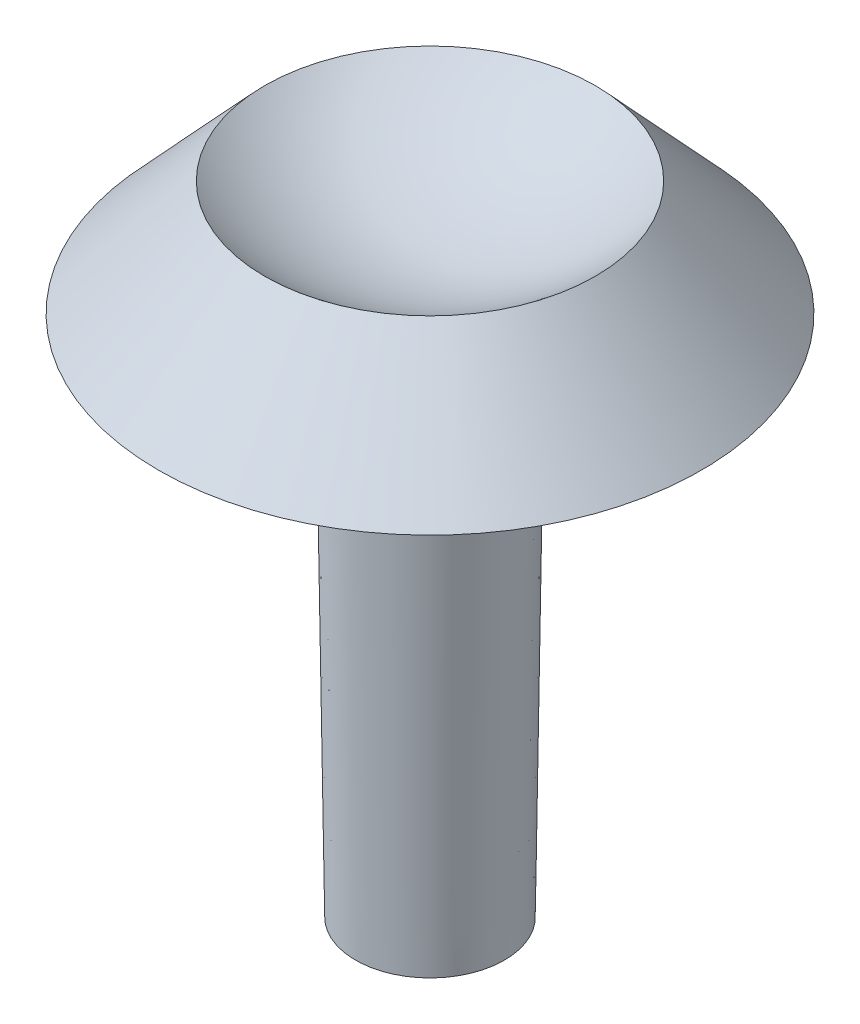
ISO-10303-21;
HEADER;
FILE_DESCRIPTION(('STEP AP214'),'2;1');
FILE_NAME('part.step','',(''),(''),'','','');
FILE_SCHEMA(('AUTOMOTIVE_DESIGN { 1 0 10303 214 1 1 1 1 }'));
ENDSEC;
DATA;
#1=APPLICATION_CONTEXT('core data for automotive mechanical design processes');
#2=APPLICATION_PROTOCOL_DEFINITION('international standard','automotive_design',2000,#1);
#3=PRODUCT_CONTEXT('',#1,'mechanical');
#4=PRODUCT('Part','Part','',(#3));
#5=PRODUCT_RELATED_PRODUCT_CATEGORY('part','',(#4));
#6=PRODUCT_DEFINITION_FORMATION('','',#4);
#7=PRODUCT_DEFINITION_CONTEXT('part definition',#1,'design');
#8=PRODUCT_DEFINITION('design','',#6,#7);
#9=PRODUCT_DEFINITION_SHAPE('','',#8);
#10=(LENGTH_UNIT() NAMED_UNIT(*) SI_UNIT(.MILLI.,.METRE.));
#11=(NAMED_UNIT(*) PLANE_ANGLE_UNIT() SI_UNIT($,.RADIAN.));
#12=(NAMED_UNIT(*) SI_UNIT($,.STERADIAN.) SOLID_ANGLE_UNIT());
#13=UNCERTAINTY_MEASURE_WITH_UNIT(LENGTH_MEASURE(1.E-05),#10,'distance_accuracy_value','');
#14=(GEOMETRIC_REPRESENTATION_CONTEXT(3) GLOBAL_UNCERTAINTY_ASSIGNED_CONTEXT((#13)) GLOBAL_UNIT_ASSIGNED_CONTEXT((#10,
#11,#12)) REPRESENTATION_CONTEXT('',''));
#15=CARTESIAN_POINT('',(0.,0.,0.));
#16=DIRECTION('',(0.,0.,1.));
#17=DIRECTION('',(1.,0.,0.));
#18=AXIS2_PLACEMENT_3D('',#15,#16,#17);
#19=CARTESIAN_POINT('',(0.5,-5.22209402082725,5.24999956749526));
#20=CARTESIAN_POINT('',(0.5,-4.66403563584378,7.08983535871012));
#21=CARTESIAN_POINT('',(0.5,-3.87970800624894,8.81486410358276));
#22=CARTESIAN_POINT('',(0.5,-2.72400693454888,10.4487864458486));
#23=B_SPLINE_CURVE_WITH_KNOTS('',3,(#19,#20,#21,#22),.UNSPECIFIED.,.F.,.F.,(4,4),(0.,1.),.UNSPECIFIED.);
#24=DIRECTION('',(-1.,0.,0.));
#25=VECTOR('',#24,1.);
#26=SURFACE_OF_LINEAR_EXTRUSION('',#23,#25);
#27=CARTESIAN_POINT('',(-0.5,-5.22209402082725,5.24999956749526));
#28=CARTESIAN_POINT('',(-0.5,-4.66403563584378,7.08983535871012));
#29=CARTESIAN_POINT('',(-0.5,-3.87970800624894,8.81486410358276));
#30=CARTESIAN_POINT('',(-0.5,-2.72400693454888,10.4487864458486));
#31=B_SPLINE_CURVE_WITH_KNOTS('',3,(#27,#28,#29,#30),.UNSPECIFIED.,.F.,.F.,(4,4),(0.,1.),.UNSPECIFIED.);
#32=CARTESIAN_POINT('',(-0.5,-5.22209402082725,5.24999956749526));
#33=VERTEX_POINT('',#32);
#34=CARTESIAN_POINT('',(-0.5,-2.72400693454888,10.4487864458486));
#35=VERTEX_POINT('',#34);
#36=EDGE_CURVE('E95',#33,#35,#31,.T.);
#37=ORIENTED_EDGE('',*,*,#36,.T.);
#38=DIRECTION('',(-1.,0.,0.));
#39=VECTOR('',#38,1.);
#40=CARTESIAN_POINT('',(0.5,-2.72400693454888,10.4487864458486));
#41=LINE('',#40,#39);
#42=CARTESIAN_POINT('',(0.5,-2.72400693454888,10.4487864458486));
#43=VERTEX_POINT('',#42);
#44=EDGE_CURVE('E12',#43,#35,#41,.T.);
#45=ORIENTED_EDGE('',*,*,#44,.F.);
#46=CARTESIAN_POINT('',(0.5,-5.22209402082725,5.24999956749526));
#47=VERTEX_POINT('',#46);
#48=EDGE_CURVE('E89',#47,#43,#23,.T.);
#49=ORIENTED_EDGE('',*,*,#48,.F.);
#50=DIRECTION('',(-1.,0.,0.));
#51=VECTOR('',#50,1.);
#52=CARTESIAN_POINT('',(0.5,-5.22209402082725,5.24999956749526));
#53=LINE('',#52,#51);
#54=EDGE_CURVE('E96',#47,#33,#53,.T.);
#55=ORIENTED_EDGE('',*,*,#54,.T.);
#56=EDGE_LOOP('',(#37,#45,#49,#55));
#57=FACE_BOUND('',#56,.T.);
#58=ADVANCED_FACE('F48',(#57),#26,.F.);
#59=CARTESIAN_POINT('',(0.5,-5.22209402082732,12.7601352627823));
#60=DIRECTION('',(0.,-0.67913987410814,-0.734008876919333));
#61=DIRECTION('',(0.,0.734008876919333,-0.67913987410814));
#62=AXIS2_PLACEMENT_3D('',#59,#60,#61);
#63=PLANE('',#62);
#64=DIRECTION('',(0.,-0.734008876919333,0.67913987410814));
#65=VECTOR('',#64,1.);
#66=CARTESIAN_POINT('',(-0.5,-5.22209402082732,12.7601352627823));
#67=LINE('',#66,#65);
#68=CARTESIAN_POINT('',(-0.5,-5.22209402082732,12.7601352627823));
#69=VERTEX_POINT('',#68);
#70=EDGE_CURVE('E77',#35,#69,#67,.T.);
#71=ORIENTED_EDGE('',*,*,#70,.T.);
#72=DIRECTION('',(-1.,0.,0.));
#73=VECTOR('',#72,1.);
#74=CARTESIAN_POINT('',(0.5,-5.22209402082732,12.7601352627823));
#75=LINE('',#74,#73);
#76=CARTESIAN_POINT('',(0.5,-5.22209402082732,12.7601352627823));
#77=VERTEX_POINT('',#76);
#78=EDGE_CURVE('E57',#77,#69,#75,.T.);
#79=ORIENTED_EDGE('',*,*,#78,.F.);
#80=DIRECTION('',(0.,-0.734008876919333,0.67913987410814));
#81=VECTOR('',#80,1.);
#82=CARTESIAN_POINT('',(0.5,-5.22209402082732,12.7601352627823));
#83=LINE('',#82,#81);
#84=EDGE_CURVE('E85',#43,#77,#83,.T.);
#85=ORIENTED_EDGE('',*,*,#84,.F.);
#86=ORIENTED_EDGE('',*,*,#44,.T.);
#87=EDGE_LOOP('',(#71,#79,#85,#86));
#88=FACE_BOUND('',#87,.T.);
#89=ADVANCED_FACE('F86',(#88),#63,.F.);
#90=CARTESIAN_POINT('',(0.5,-5.22209402082725,5.24999956749526));
#91=DIRECTION('',(0.,1.,0.));
#92=DIRECTION('',(0.,0.,1.));
#93=AXIS2_PLACEMENT_3D('',#90,#91,#92);
#94=PLANE('',#93);
#95=DIRECTION('',(0.,0.,-1.));
#96=VECTOR('',#95,1.);
#97=CARTESIAN_POINT('',(-0.5,-5.22209402082725,5.24999956749526));
#98=LINE('',#97,#96);
#99=EDGE_CURVE('E82',#69,#33,#98,.T.);
#100=ORIENTED_EDGE('',*,*,#99,.T.);
#101=ORIENTED_EDGE('',*,*,#54,.F.);
#102=DIRECTION('',(0.,0.,-1.));
#103=VECTOR('',#102,1.);
#104=CARTESIAN_POINT('',(0.5,-5.22209402082725,5.24999956749526));
#105=LINE('',#104,#103);
#106=EDGE_CURVE('E65',#77,#47,#105,.T.);
#107=ORIENTED_EDGE('',*,*,#106,.F.);
#108=ORIENTED_EDGE('',*,*,#78,.T.);
#109=EDGE_LOOP('',(#100,#101,#107,#108));
#110=FACE_BOUND('',#109,.T.);
#111=ADVANCED_FACE('F108',(#110),#94,.F.);
#112=CARTESIAN_POINT('',(0.5,-4.19716648520679,7.92661055002782));
#113=DIRECTION('',(-1.,0.,0.));
#114=DIRECTION('',(0.,0.,1.));
#115=AXIS2_PLACEMENT_3D('',#112,#113,#114);
#116=PLANE('',#115);
#117=ORIENTED_EDGE('',*,*,#48,.T.);
#118=ORIENTED_EDGE('',*,*,#84,.T.);
#119=ORIENTED_EDGE('',*,*,#106,.T.);
#120=EDGE_LOOP('',(#117,#118,#119));
#121=FACE_BOUND('',#120,.T.);
#122=ADVANCED_FACE('F92',(#121),#116,.F.);
#123=CARTESIAN_POINT('',(-0.5,-4.19716648520679,7.92661055002782));
#124=DIRECTION('',(-1.,0.,0.));
#125=DIRECTION('',(0.,0.,1.));
#126=AXIS2_PLACEMENT_3D('',#123,#124,#125);
#127=PLANE('',#126);
#128=ORIENTED_EDGE('',*,*,#36,.F.);
#129=ORIENTED_EDGE('',*,*,#99,.F.);
#130=ORIENTED_EDGE('',*,*,#70,.F.);
#131=EDGE_LOOP('',(#128,#129,#130));
#132=FACE_BOUND('',#131,.T.);
#133=ADVANCED_FACE('F109',(#132),#127,.T.);
#134=CLOSED_SHELL('',(#58,#89,#111,#122,#133));
#135=MANIFOLD_SOLID_BREP('B2',#134);
#136=CARTESIAN_POINT('',(0.,-41.1,0.));
#137=DIRECTION('',(0.,-1.,0.));
#138=DIRECTION('',(0.,0.,-1.));
#139=AXIS2_PLACEMENT_3D('',#136,#137,#138);
#140=PLANE('',#139);
#141=CARTESIAN_POINT('',(0.,-41.1,0.));
#142=DIRECTION('',(0.,-1.,0.));
#143=DIRECTION('',(0.,0.,-1.));
#144=AXIS2_PLACEMENT_3D('',#141,#142,#143);
#145=CIRCLE('',#144,4.8);
#146=CARTESIAN_POINT('',(0.,-41.1,-4.8));
#147=VERTEX_POINT('',#146);
#148=EDGE_CURVE('E47',#147,#147,#145,.T.);
#149=ORIENTED_EDGE('',*,*,#148,.T.);
#150=EDGE_LOOP('',(#149));
#151=FACE_BOUND('',#150,.T.);
#152=CARTESIAN_POINT('',(0.,-41.1,0.));
#153=DIRECTION('',(0.,-1.,0.));
#154=DIRECTION('',(0.,0.,-1.));
#155=AXIS2_PLACEMENT_3D('',#152,#153,#154);
#156=CIRCLE('',#155,2.9);
#157=CARTESIAN_POINT('',(0.,-41.1,-2.9));
#158=VERTEX_POINT('',#157);
#159=EDGE_CURVE('E197',#158,#158,#156,.T.);
#160=ORIENTED_EDGE('',*,*,#159,.F.);
#161=EDGE_LOOP('',(#160));
#162=FACE_BOUND('',#161,.T.);
#163=ADVANCED_FACE('F166',(#151,#162),#140,.T.);
#164=CARTESIAN_POINT('',(0.,-41.1,0.));
#165=DIRECTION('',(0.,1.,0.));
#166=DIRECTION('',(0.,0.,1.));
#167=AXIS2_PLACEMENT_3D('',#164,#165,#166);
#168=CONICAL_SURFACE('',#167,4.8,0.0133523221663518);
#169=CARTESIAN_POINT('',(0.,-7.4,0.));
#170=DIRECTION('',(0.,-1.,0.));
#171=DIRECTION('',(0.,0.,-1.));
#172=AXIS2_PLACEMENT_3D('',#169,#170,#171);
#173=CIRCLE('',#172,5.25);
#174=CARTESIAN_POINT('',(0.,-7.4,-5.25));
#175=VERTEX_POINT('',#174);
#176=EDGE_CURVE('E172',#175,#175,#173,.T.);
#177=ORIENTED_EDGE('',*,*,#176,.T.);
#178=EDGE_LOOP('',(#177));
#179=FACE_BOUND('',#178,.T.);
#180=ORIENTED_EDGE('',*,*,#148,.F.);
#181=EDGE_LOOP('',(#180));
#182=FACE_BOUND('',#181,.T.);
#183=ADVANCED_FACE('F216',(#179,#182),#168,.T.);
#184=CARTESIAN_POINT('',(0.,-27.1,0.));
#185=DIRECTION('',(0.,-1.,0.));
#186=DIRECTION('',(0.,0.,-1.));
#187=AXIS2_PLACEMENT_3D('',#184,#185,#186);
#188=CYLINDRICAL_SURFACE('',#187,5.25);
#189=ORIENTED_EDGE('',*,*,#176,.F.);
#190=EDGE_LOOP('',(#189));
#191=FACE_BOUND('',#190,.T.);
#192=CARTESIAN_POINT('',(0.,-5.22209402082732,0.));
#193=DIRECTION('',(0.,-1.,0.));
#194=DIRECTION('',(0.,0.,-1.));
#195=AXIS2_PLACEMENT_3D('',#192,#193,#194);
#196=CIRCLE('',#195,5.25);
#197=CARTESIAN_POINT('',(0.,-5.22209402082732,-5.25));
#198=VERTEX_POINT('',#197);
#199=EDGE_CURVE('E176',#198,#198,#196,.T.);
#200=ORIENTED_EDGE('',*,*,#199,.T.);
#201=EDGE_LOOP('',(#200));
#202=FACE_BOUND('',#201,.T.);
#203=ADVANCED_FACE('F212',(#191,#202),#188,.T.);
#204=CARTESIAN_POINT('',(0.,-5.9,0.));
#205=CARTESIAN_POINT('',(7.18894422200446,-5.9,0.));
#206=CARTESIAN_POINT('',(11.9964797117913,-1.45183983467946,0.));
#207=B_SPLINE_CURVE_WITH_KNOTS('',2,(#204,#205,#206),.UNSPECIFIED.,.F.,.F.,(3,3),(0.,1.),.UNSPECIFIED.);
#208=CARTESIAN_POINT('',(0.,-27.1,0.));
#209=DIRECTION('',(0.,-1.,0.));
#210=AXIS1_PLACEMENT('',#208,#209);
#211=SURFACE_OF_REVOLUTION('',#207,#210);
#212=CARTESIAN_POINT('',(0.,-2.72400693454888,0.));
#213=DIRECTION('',(0.,-1.,0.));
#214=DIRECTION('',(0.,0.,-1.));
#215=AXIS2_PLACEMENT_3D('',#212,#213,#214);
#216=CIRCLE('',#215,10.4487864458486);
#217=CARTESIAN_POINT('',(0.,-2.72400693454888,-10.4487864458486));
#218=VERTEX_POINT('',#217);
#219=EDGE_CURVE('E180',#218,#218,#216,.T.);
#220=ORIENTED_EDGE('',*,*,#219,.T.);
#221=EDGE_LOOP('',(#220));
#222=FACE_BOUND('',#221,.T.);
#223=ORIENTED_EDGE('',*,*,#199,.F.);
#224=EDGE_LOOP('',(#223));
#225=FACE_BOUND('',#224,.T.);
#226=ADVANCED_FACE('F207',(#222,#225),#211,.F.);
#227=CARTESIAN_POINT('',(0.,-7.4,0.));
#228=DIRECTION('',(0.,-1.,0.));
#229=DIRECTION('',(0.,0.,-1.));
#230=AXIS2_PLACEMENT_3D('',#227,#228,#229);
#231=CONICAL_SURFACE('',#230,14.7752373126684,0.746590178976288);
#232=ORIENTED_EDGE('',*,*,#219,.F.);
#233=EDGE_LOOP('',(#232));
#234=FACE_BOUND('',#233,.T.);
#235=CARTESIAN_POINT('',(0.,-7.4,0.));
#236=DIRECTION('',(0.,-1.,0.));
#237=DIRECTION('',(0.,0.,-1.));
#238=AXIS2_PLACEMENT_3D('',#235,#236,#237);
#239=CIRCLE('',#238,14.7752373126684);
#240=CARTESIAN_POINT('',(0.,-7.4,-14.7752373126684));
#241=VERTEX_POINT('',#240);
#242=EDGE_CURVE('E185',#241,#241,#239,.T.);
#243=ORIENTED_EDGE('',*,*,#242,.T.);
#244=EDGE_LOOP('',(#243));
#245=FACE_BOUND('',#244,.T.);
#246=ADVANCED_FACE('F211',(#234,#245),#231,.F.);
#247=CARTESIAN_POINT('',(0.,-7.4,0.));
#248=DIRECTION('',(0.,-1.,0.));
#249=DIRECTION('',(0.,0.,-1.));
#250=AXIS2_PLACEMENT_3D('',#247,#248,#249);
#251=PLANE('',#250);
#252=CARTESIAN_POINT('',(0.,-7.4,0.));
#253=DIRECTION('',(0.,-1.,0.));
#254=DIRECTION('',(0.,0.,-1.));
#255=AXIS2_PLACEMENT_3D('',#252,#253,#254);
#256=CIRCLE('',#255,17.5);
#257=CARTESIAN_POINT('',(0.,-7.4,-17.5));
#258=VERTEX_POINT('',#257);
#259=EDGE_CURVE('E188',#258,#258,#256,.T.);
#260=ORIENTED_EDGE('',*,*,#259,.T.);
#261=EDGE_LOOP('',(#260));
#262=FACE_BOUND('',#261,.T.);
#263=ORIENTED_EDGE('',*,*,#242,.F.);
#264=EDGE_LOOP('',(#263));
#265=FACE_BOUND('',#264,.T.);
#266=ADVANCED_FACE('F246',(#262,#265),#251,.T.);
#267=CARTESIAN_POINT('',(0.,0.,0.));
#268=DIRECTION('',(0.,-1.,0.));
#269=DIRECTION('',(0.,0.,-1.));
#270=AXIS2_PLACEMENT_3D('',#267,#268,#269);
#271=CONICAL_SURFACE('',#270,10.6531685427388,0.746590178976287);
#272=ORIENTED_EDGE('',*,*,#259,.F.);
#273=EDGE_LOOP('',(#272));
#274=FACE_BOUND('',#273,.T.);
#275=CARTESIAN_POINT('',(0.,0.,0.));
#276=DIRECTION('',(0.,-1.,0.));
#277=DIRECTION('',(0.,0.,-1.));
#278=AXIS2_PLACEMENT_3D('',#275,#276,#277);
#279=CIRCLE('',#278,10.6531685427388);
#280=CARTESIAN_POINT('',(0.,0.,-10.6531685427388));
#281=VERTEX_POINT('',#280);
#282=EDGE_CURVE('E191',#281,#281,#279,.T.);
#283=ORIENTED_EDGE('',*,*,#282,.T.);
#284=EDGE_LOOP('',(#283));
#285=FACE_BOUND('',#284,.T.);
#286=ADVANCED_FACE('F243',(#274,#285),#271,.T.);
#287=CARTESIAN_POINT('',(0.,12.6,0.));
#288=DIRECTION('',(0.,-1.,0.));
#289=DIRECTION('',(-1.,0.,0.));
#290=AXIS2_PLACEMENT_3D('',#287,#288,#289);
#291=SPHERICAL_SURFACE('',#290,16.5);
#292=ORIENTED_EDGE('',*,*,#282,.F.);
#293=EDGE_LOOP('',(#292));
#294=FACE_BOUND('',#293,.T.);
#295=ADVANCED_FACE('F236',(#294),#291,.F.);
#296=CARTESIAN_POINT('',(0.,-27.1,0.));
#297=DIRECTION('',(0.,1.,0.));
#298=DIRECTION('',(0.,0.,1.));
#299=AXIS2_PLACEMENT_3D('',#296,#297,#298);
#300=PLANE('',#299);
#301=CARTESIAN_POINT('',(0.,-27.1,0.));
#302=DIRECTION('',(0.,-1.,0.));
#303=DIRECTION('',(0.,0.,-1.));
#304=AXIS2_PLACEMENT_3D('',#301,#302,#303);
#305=CIRCLE('',#304,2.9);
#306=CARTESIAN_POINT('',(0.,-27.1,-2.9));
#307=VERTEX_POINT('',#306);
#308=EDGE_CURVE('E194',#307,#307,#305,.T.);
#309=ORIENTED_EDGE('',*,*,#308,.T.);
#310=EDGE_LOOP('',(#309));
#311=FACE_BOUND('',#310,.T.);
#312=ADVANCED_FACE('F230',(#311),#300,.F.);
#313=CARTESIAN_POINT('',(0.,-27.1,0.));
#314=DIRECTION('',(0.,-1.,0.));
#315=DIRECTION('',(0.,0.,-1.));
#316=AXIS2_PLACEMENT_3D('',#313,#314,#315);
#317=CYLINDRICAL_SURFACE('',#316,2.9);
#318=ORIENTED_EDGE('',*,*,#308,.F.);
#319=EDGE_LOOP('',(#318));
#320=FACE_BOUND('',#319,.T.);
#321=ORIENTED_EDGE('',*,*,#159,.T.);
#322=EDGE_LOOP('',(#321));
#323=FACE_BOUND('',#322,.T.);
#324=ADVANCED_FACE('F228',(#320,#323),#317,.F.);
#325=CLOSED_SHELL('',(#163,#183,#203,#226,#246,#266,#286,#295,#312,#324));
#326=MANIFOLD_SOLID_BREP('B6',#325);
#327=ADVANCED_BREP_SHAPE_REPRESENTATION('',(#18,#135,#326),#14);
#328=SHAPE_DEFINITION_REPRESENTATION(#9,#327);
ENDSEC;
END-ISO-10303-21;
